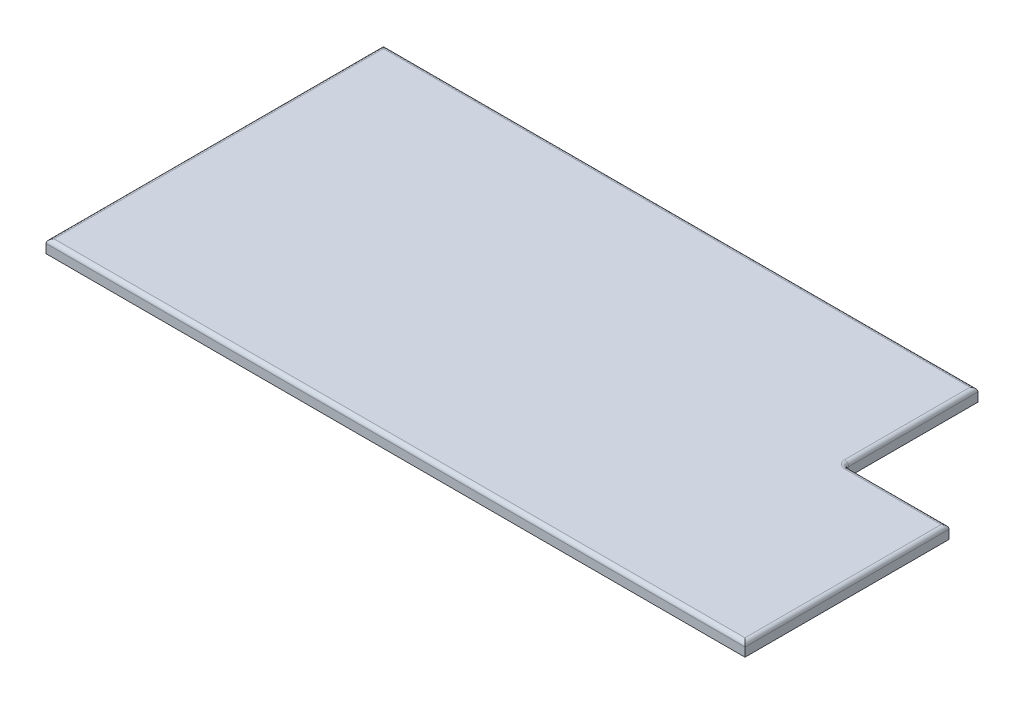
ISO-10303-21;
HEADER;
FILE_DESCRIPTION(('STEP AP214'),'2;1');
FILE_NAME('part.step','',(''),(''),'','','');
FILE_SCHEMA(('AUTOMOTIVE_DESIGN { 1 0 10303 214 1 1 1 1 }'));
ENDSEC;
DATA;
#1=APPLICATION_CONTEXT('core data for automotive mechanical design processes');
#2=APPLICATION_PROTOCOL_DEFINITION('international standard','automotive_design',2000,#1);
#3=PRODUCT_CONTEXT('',#1,'mechanical');
#4=PRODUCT('Part','Part','',(#3));
#5=PRODUCT_RELATED_PRODUCT_CATEGORY('part','',(#4));
#6=PRODUCT_DEFINITION_FORMATION('','',#4);
#7=PRODUCT_DEFINITION_CONTEXT('part definition',#1,'design');
#8=PRODUCT_DEFINITION('design','',#6,#7);
#9=PRODUCT_DEFINITION_SHAPE('','',#8);
#10=(LENGTH_UNIT() NAMED_UNIT(*) SI_UNIT(.MILLI.,.METRE.));
#11=(NAMED_UNIT(*) PLANE_ANGLE_UNIT() SI_UNIT($,.RADIAN.));
#12=(NAMED_UNIT(*) SI_UNIT($,.STERADIAN.) SOLID_ANGLE_UNIT());
#13=UNCERTAINTY_MEASURE_WITH_UNIT(LENGTH_MEASURE(1.E-05),#10,'distance_accuracy_value','');
#14=(GEOMETRIC_REPRESENTATION_CONTEXT(3) GLOBAL_UNCERTAINTY_ASSIGNED_CONTEXT((#13)) GLOBAL_UNIT_ASSIGNED_CONTEXT((#10,
#11,#12)) REPRESENTATION_CONTEXT('',''));
#15=CARTESIAN_POINT('',(0.,0.,0.));
#16=DIRECTION('',(0.,0.,1.));
#17=DIRECTION('',(1.,0.,0.));
#18=AXIS2_PLACEMENT_3D('',#15,#16,#17);
#19=CARTESIAN_POINT('',(0.,1.6,0.));
#20=DIRECTION('',(1.,0.,0.));
#21=DIRECTION('',(0.,0.,-1.));
#22=AXIS2_PLACEMENT_3D('',#19,#20,#21);
#23=PLANE('',#22);
#24=DIRECTION('',(0.,-1.,0.));
#25=VECTOR('',#24,1.);
#26=CARTESIAN_POINT('',(0.,1.6,0.));
#27=LINE('',#26,#25);
#28=CARTESIAN_POINT('',(0.,1.1,0.));
#29=VERTEX_POINT('',#28);
#30=CARTESIAN_POINT('',(0.,0.,0.));
#31=VERTEX_POINT('',#30);
#32=EDGE_CURVE('E157',#29,#31,#27,.T.);
#33=ORIENTED_EDGE('',*,*,#32,.F.);
#34=DIRECTION('',(0.,0.,1.));
#35=VECTOR('',#34,1.);
#36=CARTESIAN_POINT('',(0.,1.1,0.));
#37=LINE('',#36,#35);
#38=CARTESIAN_POINT('',(0.,1.1,-42.));
#39=VERTEX_POINT('',#38);
#40=EDGE_CURVE('E178',#29,#39,#37,.F.);
#41=ORIENTED_EDGE('',*,*,#40,.T.);
#42=DIRECTION('',(0.,-1.,0.));
#43=VECTOR('',#42,1.);
#44=CARTESIAN_POINT('',(0.,1.6,-42.));
#45=LINE('',#44,#43);
#46=CARTESIAN_POINT('',(0.,0.,-42.));
#47=VERTEX_POINT('',#46);
#48=EDGE_CURVE('E146',#39,#47,#45,.T.);
#49=ORIENTED_EDGE('',*,*,#48,.T.);
#50=DIRECTION('',(0.,0.,1.));
#51=VECTOR('',#50,1.);
#52=CARTESIAN_POINT('',(0.,0.,0.));
#53=LINE('',#52,#51);
#54=EDGE_CURVE('E145',#47,#31,#53,.T.);
#55=ORIENTED_EDGE('',*,*,#54,.T.);
#56=EDGE_LOOP('',(#33,#41,#49,#55));
#57=FACE_BOUND('',#56,.T.);
#58=ADVANCED_FACE('F42',(#57),#23,.F.);
#59=CARTESIAN_POINT('',(0.,1.6,0.));
#60=DIRECTION('',(0.,0.,-1.));
#61=DIRECTION('',(-1.,0.,0.));
#62=AXIS2_PLACEMENT_3D('',#59,#60,#61);
#63=PLANE('',#62);
#64=DIRECTION('',(0.,-1.,0.));
#65=VECTOR('',#64,1.);
#66=CARTESIAN_POINT('',(87.,1.6,0.));
#67=LINE('',#66,#65);
#68=CARTESIAN_POINT('',(87.,1.1,0.));
#69=VERTEX_POINT('',#68);
#70=CARTESIAN_POINT('',(87.,0.,0.));
#71=VERTEX_POINT('',#70);
#72=EDGE_CURVE('E149',#69,#71,#67,.T.);
#73=ORIENTED_EDGE('',*,*,#72,.F.);
#74=DIRECTION('',(1.,0.,0.));
#75=VECTOR('',#74,1.);
#76=CARTESIAN_POINT('',(0.,1.1,0.));
#77=LINE('',#76,#75);
#78=EDGE_CURVE('E175',#69,#29,#77,.F.);
#79=ORIENTED_EDGE('',*,*,#78,.T.);
#80=ORIENTED_EDGE('',*,*,#32,.T.);
#81=DIRECTION('',(1.,0.,0.));
#82=VECTOR('',#81,1.);
#83=CARTESIAN_POINT('',(0.,0.,0.));
#84=LINE('',#83,#82);
#85=EDGE_CURVE('E152',#31,#71,#84,.T.);
#86=ORIENTED_EDGE('',*,*,#85,.T.);
#87=EDGE_LOOP('',(#73,#79,#80,#86));
#88=FACE_BOUND('',#87,.T.);
#89=ADVANCED_FACE('F236',(#88),#63,.F.);
#90=CARTESIAN_POINT('',(87.,1.6,0.));
#91=DIRECTION('',(-1.,0.,0.));
#92=DIRECTION('',(0.,0.,1.));
#93=AXIS2_PLACEMENT_3D('',#90,#91,#92);
#94=PLANE('',#93);
#95=DIRECTION('',(0.,1.,0.));
#96=VECTOR('',#95,1.);
#97=CARTESIAN_POINT('',(87.,0.,-25.4));
#98=LINE('',#97,#96);
#99=CARTESIAN_POINT('',(87.,0.,-25.4));
#100=VERTEX_POINT('',#99);
#101=CARTESIAN_POINT('',(87.,1.1,-25.4));
#102=VERTEX_POINT('',#101);
#103=EDGE_CURVE('E140',#100,#102,#98,.T.);
#104=ORIENTED_EDGE('',*,*,#103,.T.);
#105=DIRECTION('',(0.,0.,-1.));
#106=VECTOR('',#105,1.);
#107=CARTESIAN_POINT('',(87.,1.1,0.));
#108=LINE('',#107,#106);
#109=EDGE_CURVE('E51',#102,#69,#108,.F.);
#110=ORIENTED_EDGE('',*,*,#109,.T.);
#111=ORIENTED_EDGE('',*,*,#72,.T.);
#112=DIRECTION('',(0.,0.,-1.));
#113=VECTOR('',#112,1.);
#114=CARTESIAN_POINT('',(87.,0.,0.));
#115=LINE('',#114,#113);
#116=EDGE_CURVE('E147',#71,#100,#115,.T.);
#117=ORIENTED_EDGE('',*,*,#116,.T.);
#118=EDGE_LOOP('',(#104,#110,#111,#117));
#119=FACE_BOUND('',#118,.T.);
#120=ADVANCED_FACE('F231',(#119),#94,.F.);
#121=CARTESIAN_POINT('',(0.,1.6,-42.));
#122=DIRECTION('',(0.,0.,1.));
#123=DIRECTION('',(1.,0.,0.));
#124=AXIS2_PLACEMENT_3D('',#121,#122,#123);
#125=PLANE('',#124);
#126=ORIENTED_EDGE('',*,*,#48,.F.);
#127=DIRECTION('',(-1.,0.,0.));
#128=VECTOR('',#127,1.);
#129=CARTESIAN_POINT('',(0.,1.1,-42.));
#130=LINE('',#129,#128);
#131=CARTESIAN_POINT('',(74.,1.1,-42.));
#132=VERTEX_POINT('',#131);
#133=EDGE_CURVE('E139',#39,#132,#130,.F.);
#134=ORIENTED_EDGE('',*,*,#133,.T.);
#135=DIRECTION('',(0.,1.,0.));
#136=VECTOR('',#135,1.);
#137=CARTESIAN_POINT('',(74.,0.,-42.));
#138=LINE('',#137,#136);
#139=CARTESIAN_POINT('',(74.,0.,-42.));
#140=VERTEX_POINT('',#139);
#141=EDGE_CURVE('E125',#140,#132,#138,.T.);
#142=ORIENTED_EDGE('',*,*,#141,.F.);
#143=DIRECTION('',(-1.,0.,0.));
#144=VECTOR('',#143,1.);
#145=CARTESIAN_POINT('',(0.,0.,-42.));
#146=LINE('',#145,#144);
#147=EDGE_CURVE('E136',#140,#47,#146,.T.);
#148=ORIENTED_EDGE('',*,*,#147,.T.);
#149=EDGE_LOOP('',(#126,#134,#142,#148));
#150=FACE_BOUND('',#149,.T.);
#151=ADVANCED_FACE('F135',(#150),#125,.F.);
#152=CARTESIAN_POINT('',(0.,1.6,0.));
#153=DIRECTION('',(0.,-1.,0.));
#154=DIRECTION('',(0.,0.,-1.));
#155=AXIS2_PLACEMENT_3D('',#152,#153,#154);
#156=PLANE('',#155);
#157=DIRECTION('',(-1.,0.,0.));
#158=VECTOR('',#157,1.);
#159=CARTESIAN_POINT('',(0.,1.6,-41.5));
#160=LINE('',#159,#158);
#161=CARTESIAN_POINT('',(73.5,1.6,-41.5));
#162=VERTEX_POINT('',#161);
#163=CARTESIAN_POINT('',(0.5,1.6,-41.5));
#164=VERTEX_POINT('',#163);
#165=EDGE_CURVE('E171',#162,#164,#160,.T.);
#166=ORIENTED_EDGE('',*,*,#165,.T.);
#167=DIRECTION('',(0.,0.,1.));
#168=VECTOR('',#167,1.);
#169=CARTESIAN_POINT('',(0.5,1.6,0.));
#170=LINE('',#169,#168);
#171=CARTESIAN_POINT('',(0.5,1.6,-0.5));
#172=VERTEX_POINT('',#171);
#173=EDGE_CURVE('E173',#164,#172,#170,.T.);
#174=ORIENTED_EDGE('',*,*,#173,.T.);
#175=DIRECTION('',(1.,0.,0.));
#176=VECTOR('',#175,1.);
#177=CARTESIAN_POINT('',(0.,1.6,-0.5));
#178=LINE('',#177,#176);
#179=CARTESIAN_POINT('',(86.5,1.6,-0.5));
#180=VERTEX_POINT('',#179);
#181=EDGE_CURVE('E163',#172,#180,#178,.T.);
#182=ORIENTED_EDGE('',*,*,#181,.T.);
#183=DIRECTION('',(0.,0.,-1.));
#184=VECTOR('',#183,1.);
#185=CARTESIAN_POINT('',(86.5,1.6,0.));
#186=LINE('',#185,#184);
#187=CARTESIAN_POINT('',(86.5,1.6,-24.9));
#188=VERTEX_POINT('',#187);
#189=EDGE_CURVE('E159',#180,#188,#186,.T.);
#190=ORIENTED_EDGE('',*,*,#189,.T.);
#191=DIRECTION('',(1.,0.,0.));
#192=VECTOR('',#191,1.);
#193=CARTESIAN_POINT('',(0.,1.6,-24.9));
#194=LINE('',#193,#192);
#195=CARTESIAN_POINT('',(74.5,1.6,-24.9));
#196=VERTEX_POINT('',#195);
#197=EDGE_CURVE('E161',#188,#196,#194,.F.);
#198=ORIENTED_EDGE('',*,*,#197,.T.);
#199=CARTESIAN_POINT('',(74.5,1.6,-25.9));
#200=DIRECTION('',(0.,-1.,0.));
#201=DIRECTION('',(0.,0.,-1.));
#202=AXIS2_PLACEMENT_3D('',#199,#200,#201);
#203=CIRCLE('',#202,1.);
#204=CARTESIAN_POINT('',(73.5,1.6,-25.9));
#205=VERTEX_POINT('',#204);
#206=EDGE_CURVE('E166',#205,#196,#203,.F.);
#207=ORIENTED_EDGE('',*,*,#206,.F.);
#208=DIRECTION('',(0.,0.,1.));
#209=VECTOR('',#208,1.);
#210=CARTESIAN_POINT('',(73.5,1.6,0.));
#211=LINE('',#210,#209);
#212=EDGE_CURVE('E169',#205,#162,#211,.F.);
#213=ORIENTED_EDGE('',*,*,#212,.T.);
#214=EDGE_LOOP('',(#166,#174,#182,#190,#198,#207,#213));
#215=FACE_BOUND('',#214,.T.);
#216=ADVANCED_FACE('F216',(#215),#156,.F.);
#217=CARTESIAN_POINT('',(0.,0.,0.));
#218=DIRECTION('',(0.,-1.,0.));
#219=DIRECTION('',(0.,0.,-1.));
#220=AXIS2_PLACEMENT_3D('',#217,#218,#219);
#221=PLANE('',#220);
#222=DIRECTION('',(0.,0.,1.));
#223=VECTOR('',#222,1.);
#224=CARTESIAN_POINT('',(74.,0.,-42.));
#225=LINE('',#224,#223);
#226=CARTESIAN_POINT('',(74.,0.,-25.9));
#227=VERTEX_POINT('',#226);
#228=EDGE_CURVE('E122',#140,#227,#225,.T.);
#229=ORIENTED_EDGE('',*,*,#228,.T.);
#230=CARTESIAN_POINT('',(74.5,0.,-25.9));
#231=DIRECTION('',(0.,-1.,0.));
#232=DIRECTION('',(0.,0.,-1.));
#233=AXIS2_PLACEMENT_3D('',#230,#231,#232);
#234=CIRCLE('',#233,0.5);
#235=CARTESIAN_POINT('',(74.5,0.,-25.4));
#236=VERTEX_POINT('',#235);
#237=EDGE_CURVE('E11',#227,#236,#234,.F.);
#238=ORIENTED_EDGE('',*,*,#237,.T.);
#239=DIRECTION('',(1.,0.,0.));
#240=VECTOR('',#239,1.);
#241=CARTESIAN_POINT('',(87.,0.,-25.4));
#242=LINE('',#241,#240);
#243=EDGE_CURVE('E130',#236,#100,#242,.T.);
#244=ORIENTED_EDGE('',*,*,#243,.T.);
#245=ORIENTED_EDGE('',*,*,#116,.F.);
#246=ORIENTED_EDGE('',*,*,#85,.F.);
#247=ORIENTED_EDGE('',*,*,#54,.F.);
#248=ORIENTED_EDGE('',*,*,#147,.F.);
#249=EDGE_LOOP('',(#229,#238,#244,#245,#246,#247,#248));
#250=FACE_BOUND('',#249,.T.);
#251=ADVANCED_FACE('F142',(#250),#221,.T.);
#252=CARTESIAN_POINT('',(87.,0.,-25.4));
#253=DIRECTION('',(0.,0.,1.));
#254=DIRECTION('',(1.,0.,0.));
#255=AXIS2_PLACEMENT_3D('',#252,#253,#254);
#256=PLANE('',#255);
#257=DIRECTION('',(0.,1.,0.));
#258=VECTOR('',#257,1.);
#259=CARTESIAN_POINT('',(74.5,1.6,-25.4));
#260=LINE('',#259,#258);
#261=CARTESIAN_POINT('',(74.5,1.1,-25.4));
#262=VERTEX_POINT('',#261);
#263=EDGE_CURVE('E59',#236,#262,#260,.T.);
#264=ORIENTED_EDGE('',*,*,#263,.T.);
#265=DIRECTION('',(1.,0.,0.));
#266=VECTOR('',#265,1.);
#267=CARTESIAN_POINT('',(87.,1.1,-25.4));
#268=LINE('',#267,#266);
#269=EDGE_CURVE('E185',#262,#102,#268,.T.);
#270=ORIENTED_EDGE('',*,*,#269,.T.);
#271=ORIENTED_EDGE('',*,*,#103,.F.);
#272=ORIENTED_EDGE('',*,*,#243,.F.);
#273=EDGE_LOOP('',(#264,#270,#271,#272));
#274=FACE_BOUND('',#273,.T.);
#275=ADVANCED_FACE('F322',(#274),#256,.F.);
#276=CARTESIAN_POINT('',(74.,0.,-42.));
#277=DIRECTION('',(-1.,0.,0.));
#278=DIRECTION('',(0.,0.,1.));
#279=AXIS2_PLACEMENT_3D('',#276,#277,#278);
#280=PLANE('',#279);
#281=ORIENTED_EDGE('',*,*,#141,.T.);
#282=DIRECTION('',(0.,0.,1.));
#283=VECTOR('',#282,1.);
#284=CARTESIAN_POINT('',(74.,1.1,-42.));
#285=LINE('',#284,#283);
#286=CARTESIAN_POINT('',(74.,1.1,-25.9));
#287=VERTEX_POINT('',#286);
#288=EDGE_CURVE('E182',#132,#287,#285,.T.);
#289=ORIENTED_EDGE('',*,*,#288,.T.);
#290=DIRECTION('',(0.,1.,0.));
#291=VECTOR('',#290,1.);
#292=CARTESIAN_POINT('',(74.,0.,-25.9));
#293=LINE('',#292,#291);
#294=EDGE_CURVE('E128',#287,#227,#293,.F.);
#295=ORIENTED_EDGE('',*,*,#294,.T.);
#296=ORIENTED_EDGE('',*,*,#228,.F.);
#297=EDGE_LOOP('',(#281,#289,#295,#296));
#298=FACE_BOUND('',#297,.T.);
#299=ADVANCED_FACE('F124',(#298),#280,.F.);
#300=CARTESIAN_POINT('',(74.5,0.,-25.9));
#301=DIRECTION('',(0.,-1.,0.));
#302=DIRECTION('',(0.,0.,-1.));
#303=AXIS2_PLACEMENT_3D('',#300,#301,#302);
#304=CYLINDRICAL_SURFACE('',#303,0.5);
#305=ORIENTED_EDGE('',*,*,#237,.F.);
#306=ORIENTED_EDGE('',*,*,#294,.F.);
#307=CARTESIAN_POINT('',(74.5,1.1,-25.9));
#308=DIRECTION('',(0.,-1.,0.));
#309=DIRECTION('',(0.,0.,-1.));
#310=AXIS2_PLACEMENT_3D('',#307,#308,#309);
#311=CIRCLE('',#310,0.5);
#312=EDGE_CURVE('E203',#262,#287,#311,.T.);
#313=ORIENTED_EDGE('',*,*,#312,.F.);
#314=ORIENTED_EDGE('',*,*,#263,.F.);
#315=EDGE_LOOP('',(#305,#306,#313,#314));
#316=FACE_BOUND('',#315,.T.);
#317=ADVANCED_FACE('F44',(#316),#304,.F.);
#318=CARTESIAN_POINT('',(73.5,1.1,-42.));
#319=DIRECTION('',(0.,0.,1.));
#320=DIRECTION('',(1.,0.,0.));
#321=AXIS2_PLACEMENT_3D('',#318,#319,#320);
#322=CYLINDRICAL_SURFACE('',#321,0.5);
#323=CARTESIAN_POINT('',(73.5,1.1,-41.5));
#324=DIRECTION('',(0.707106781186547,0.,0.707106781186547));
#325=DIRECTION('',(-0.707106781186547,0.,0.707106781186547));
#326=AXIS2_PLACEMENT_3D('',#323,#324,#325);
#327=ELLIPSE('',#326,0.707106781186547,0.5);
#328=EDGE_CURVE('E201',#162,#132,#327,.F.);
#329=ORIENTED_EDGE('',*,*,#328,.F.);
#330=ORIENTED_EDGE('',*,*,#212,.F.);
#331=CARTESIAN_POINT('',(73.5,1.1,-25.9));
#332=DIRECTION('',(0.,0.,1.));
#333=DIRECTION('',(1.,0.,0.));
#334=AXIS2_PLACEMENT_3D('',#331,#332,#333);
#335=CIRCLE('',#334,0.5);
#336=EDGE_CURVE('E46',#287,#205,#335,.T.);
#337=ORIENTED_EDGE('',*,*,#336,.F.);
#338=ORIENTED_EDGE('',*,*,#288,.F.);
#339=EDGE_LOOP('',(#329,#330,#337,#338));
#340=FACE_BOUND('',#339,.T.);
#341=ADVANCED_FACE('F213',(#340),#322,.T.);
#342=CARTESIAN_POINT('',(74.5,1.1,-25.9));
#343=DIRECTION('',(0.,-1.,0.));
#344=DIRECTION('',(0.,0.,-1.));
#345=AXIS2_PLACEMENT_3D('',#342,#343,#344);
#346=TOROIDAL_SURFACE('',#345,1.,0.5);
#347=ORIENTED_EDGE('',*,*,#336,.T.);
#348=ORIENTED_EDGE('',*,*,#206,.T.);
#349=CARTESIAN_POINT('',(74.5,1.1,-24.9));
#350=DIRECTION('',(-1.,0.,0.));
#351=DIRECTION('',(0.,0.,1.));
#352=AXIS2_PLACEMENT_3D('',#349,#350,#351);
#353=CIRCLE('',#352,0.5);
#354=EDGE_CURVE('E198',#262,#196,#353,.F.);
#355=ORIENTED_EDGE('',*,*,#354,.F.);
#356=ORIENTED_EDGE('',*,*,#312,.T.);
#357=EDGE_LOOP('',(#347,#348,#355,#356));
#358=FACE_BOUND('',#357,.T.);
#359=ADVANCED_FACE('F209',(#358),#346,.T.);
#360=CARTESIAN_POINT('',(0.,1.1,-41.5));
#361=DIRECTION('',(-1.,0.,0.));
#362=DIRECTION('',(0.,0.,1.));
#363=AXIS2_PLACEMENT_3D('',#360,#361,#362);
#364=CYLINDRICAL_SURFACE('',#363,0.5);
#365=ORIENTED_EDGE('',*,*,#328,.T.);
#366=ORIENTED_EDGE('',*,*,#133,.F.);
#367=CARTESIAN_POINT('',(0.5,1.1,-41.5));
#368=DIRECTION('',(-0.707106781186547,0.,0.707106781186547));
#369=DIRECTION('',(-0.707106781186547,0.,-0.707106781186547));
#370=AXIS2_PLACEMENT_3D('',#367,#368,#369);
#371=ELLIPSE('',#370,0.707106781186547,0.5);
#372=EDGE_CURVE('E195',#164,#39,#371,.T.);
#373=ORIENTED_EDGE('',*,*,#372,.F.);
#374=ORIENTED_EDGE('',*,*,#165,.F.);
#375=EDGE_LOOP('',(#365,#366,#373,#374));
#376=FACE_BOUND('',#375,.T.);
#377=ADVANCED_FACE('F249',(#376),#364,.T.);
#378=CARTESIAN_POINT('',(87.,1.1,-24.9));
#379=DIRECTION('',(1.,0.,0.));
#380=DIRECTION('',(0.,0.,-1.));
#381=AXIS2_PLACEMENT_3D('',#378,#379,#380);
#382=CYLINDRICAL_SURFACE('',#381,0.5);
#383=ORIENTED_EDGE('',*,*,#354,.T.);
#384=ORIENTED_EDGE('',*,*,#197,.F.);
#385=CARTESIAN_POINT('',(86.5,1.1,-24.9));
#386=DIRECTION('',(-0.707106781186547,0.,-0.707106781186547));
#387=DIRECTION('',(0.707106781186547,0.,-0.707106781186547));
#388=AXIS2_PLACEMENT_3D('',#385,#386,#387);
#389=ELLIPSE('',#388,0.707106781186547,0.5);
#390=EDGE_CURVE('E192',#102,#188,#389,.F.);
#391=ORIENTED_EDGE('',*,*,#390,.F.);
#392=ORIENTED_EDGE('',*,*,#269,.F.);
#393=EDGE_LOOP('',(#383,#384,#391,#392));
#394=FACE_BOUND('',#393,.T.);
#395=ADVANCED_FACE('F222',(#394),#382,.T.);
#396=CARTESIAN_POINT('',(0.5,1.1,0.));
#397=DIRECTION('',(0.,0.,1.));
#398=DIRECTION('',(1.,0.,0.));
#399=AXIS2_PLACEMENT_3D('',#396,#397,#398);
#400=CYLINDRICAL_SURFACE('',#399,0.5);
#401=ORIENTED_EDGE('',*,*,#372,.T.);
#402=ORIENTED_EDGE('',*,*,#40,.F.);
#403=CARTESIAN_POINT('',(0.5,1.1,-0.5));
#404=DIRECTION('',(0.707106781186547,0.,0.707106781186547));
#405=DIRECTION('',(-0.707106781186547,0.,0.707106781186547));
#406=AXIS2_PLACEMENT_3D('',#403,#404,#405);
#407=ELLIPSE('',#406,0.707106781186547,0.5);
#408=EDGE_CURVE('E190',#172,#29,#407,.T.);
#409=ORIENTED_EDGE('',*,*,#408,.F.);
#410=ORIENTED_EDGE('',*,*,#173,.F.);
#411=EDGE_LOOP('',(#401,#402,#409,#410));
#412=FACE_BOUND('',#411,.T.);
#413=ADVANCED_FACE('F246',(#412),#400,.T.);
#414=CARTESIAN_POINT('',(86.5,1.1,0.));
#415=DIRECTION('',(0.,0.,-1.));
#416=DIRECTION('',(-1.,0.,0.));
#417=AXIS2_PLACEMENT_3D('',#414,#415,#416);
#418=CYLINDRICAL_SURFACE('',#417,0.5);
#419=ORIENTED_EDGE('',*,*,#390,.T.);
#420=ORIENTED_EDGE('',*,*,#189,.F.);
#421=CARTESIAN_POINT('',(86.5,1.1,-0.5));
#422=DIRECTION('',(0.707106781186547,0.,-0.707106781186547));
#423=DIRECTION('',(-0.707106781186547,0.,-0.707106781186547));
#424=AXIS2_PLACEMENT_3D('',#421,#422,#423);
#425=ELLIPSE('',#424,0.707106781186547,0.5);
#426=EDGE_CURVE('E188',#69,#180,#425,.F.);
#427=ORIENTED_EDGE('',*,*,#426,.F.);
#428=ORIENTED_EDGE('',*,*,#109,.F.);
#429=EDGE_LOOP('',(#419,#420,#427,#428));
#430=FACE_BOUND('',#429,.T.);
#431=ADVANCED_FACE('F226',(#430),#418,.T.);
#432=CARTESIAN_POINT('',(0.,1.1,-0.5));
#433=DIRECTION('',(1.,0.,0.));
#434=DIRECTION('',(0.,0.,-1.));
#435=AXIS2_PLACEMENT_3D('',#432,#433,#434);
#436=CYLINDRICAL_SURFACE('',#435,0.5);
#437=ORIENTED_EDGE('',*,*,#408,.T.);
#438=ORIENTED_EDGE('',*,*,#78,.F.);
#439=ORIENTED_EDGE('',*,*,#426,.T.);
#440=ORIENTED_EDGE('',*,*,#181,.F.);
#441=EDGE_LOOP('',(#437,#438,#439,#440));
#442=FACE_BOUND('',#441,.T.);
#443=ADVANCED_FACE('F240',(#442),#436,.T.);
#444=CLOSED_SHELL('',(#58,#89,#120,#151,#216,#251,#275,#299,#317,#341,#359,#377,#395,#413,#431,#443));
#445=MANIFOLD_SOLID_BREP('B2',#444);
#446=ADVANCED_BREP_SHAPE_REPRESENTATION('',(#18,#445),#14);
#447=SHAPE_DEFINITION_REPRESENTATION(#9,#446);
ENDSEC;
END-ISO-10303-21;
